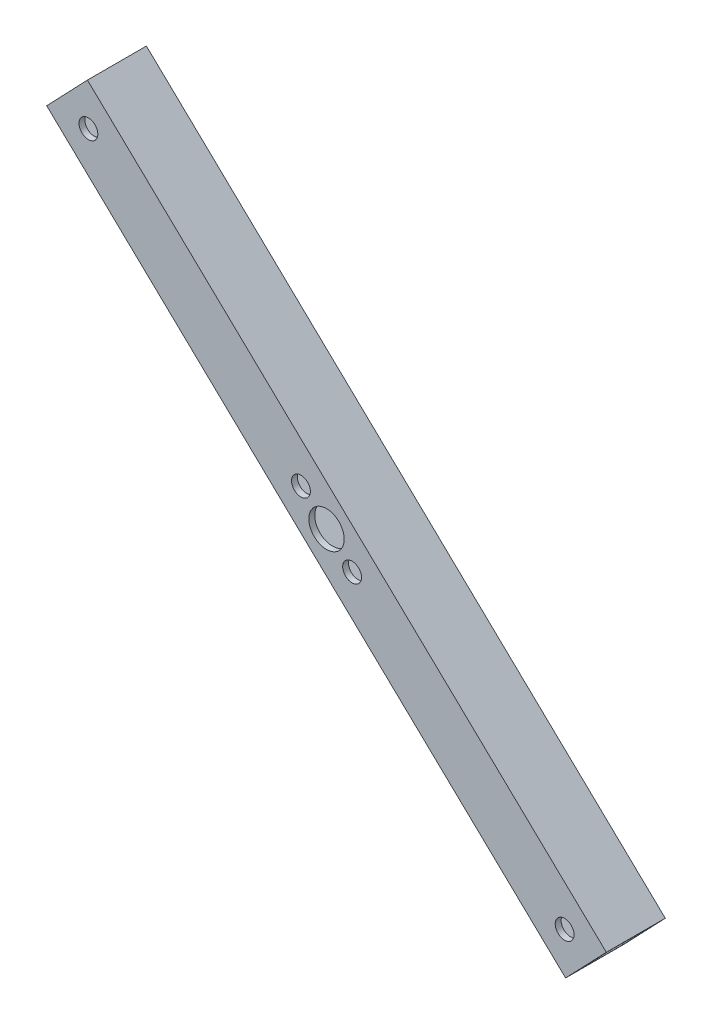
ISO-10303-21;
HEADER;
FILE_DESCRIPTION(('STEP AP214'),'2;1');
FILE_NAME('part.step','',(''),(''),'','','');
FILE_SCHEMA(('AUTOMOTIVE_DESIGN { 1 0 10303 214 1 1 1 1 }'));
ENDSEC;
DATA;
#1=APPLICATION_CONTEXT('core data for automotive mechanical design processes');
#2=APPLICATION_PROTOCOL_DEFINITION('international standard','automotive_design',2000,#1);
#3=PRODUCT_CONTEXT('',#1,'mechanical');
#4=PRODUCT('Part','Part','',(#3));
#5=PRODUCT_RELATED_PRODUCT_CATEGORY('part','',(#4));
#6=PRODUCT_DEFINITION_FORMATION('','',#4);
#7=PRODUCT_DEFINITION_CONTEXT('part definition',#1,'design');
#8=PRODUCT_DEFINITION('design','',#6,#7);
#9=PRODUCT_DEFINITION_SHAPE('','',#8);
#10=(LENGTH_UNIT() NAMED_UNIT(*) SI_UNIT(.MILLI.,.METRE.));
#11=(NAMED_UNIT(*) PLANE_ANGLE_UNIT() SI_UNIT($,.RADIAN.));
#12=(NAMED_UNIT(*) SI_UNIT($,.STERADIAN.) SOLID_ANGLE_UNIT());
#13=UNCERTAINTY_MEASURE_WITH_UNIT(LENGTH_MEASURE(1.E-05),#10,'distance_accuracy_value','');
#14=(GEOMETRIC_REPRESENTATION_CONTEXT(3) GLOBAL_UNCERTAINTY_ASSIGNED_CONTEXT((#13)) GLOBAL_UNIT_ASSIGNED_CONTEXT((#10,
#11,#12)) REPRESENTATION_CONTEXT('',''));
#15=CARTESIAN_POINT('',(0.,0.,0.));
#16=DIRECTION('',(0.,0.,1.));
#17=DIRECTION('',(1.,0.,0.));
#18=AXIS2_PLACEMENT_3D('',#15,#16,#17);
#19=CARTESIAN_POINT('',(-3.77609817293488,84.2848181798707,10.));
#20=DIRECTION('',(0.,0.,-1.));
#21=DIRECTION('',(-1.,0.,0.));
#22=AXIS2_PLACEMENT_3D('',#19,#20,#21);
#23=CYLINDRICAL_SURFACE('',#22,1.6);
#24=CARTESIAN_POINT('',(-3.77609817293488,84.2848181798707,9.));
#25=DIRECTION('',(0.,0.,1.));
#26=DIRECTION('',(1.,0.,0.));
#27=AXIS2_PLACEMENT_3D('',#24,#25,#26);
#28=CIRCLE('',#27,1.6);
#29=CARTESIAN_POINT('',(-2.17609817293488,84.2848181798707,9.));
#30=VERTEX_POINT('',#29);
#31=EDGE_CURVE('E145',#30,#30,#28,.T.);
#32=ORIENTED_EDGE('',*,*,#31,.F.);
#33=EDGE_LOOP('',(#32));
#34=FACE_BOUND('',#33,.T.);
#35=CARTESIAN_POINT('',(-3.77609817293488,84.2848181798707,10.));
#36=DIRECTION('',(0.,0.,1.));
#37=DIRECTION('',(1.,0.,0.));
#38=AXIS2_PLACEMENT_3D('',#35,#36,#37);
#39=CIRCLE('',#38,1.6);
#40=CARTESIAN_POINT('',(-2.17609817293488,84.2848181798707,10.));
#41=VERTEX_POINT('',#40);
#42=EDGE_CURVE('E155',#41,#41,#39,.T.);
#43=ORIENTED_EDGE('',*,*,#42,.T.);
#44=EDGE_LOOP('',(#43));
#45=FACE_BOUND('',#44,.T.);
#46=ADVANCED_FACE('F44',(#34,#45),#23,.F.);
#47=CARTESIAN_POINT('',(76.990408140841,7.09173909976924,10.));
#48=DIRECTION('',(0.,0.,-1.));
#49=DIRECTION('',(-1.,0.,0.));
#50=AXIS2_PLACEMENT_3D('',#47,#48,#49);
#51=CYLINDRICAL_SURFACE('',#50,1.60000000000001);
#52=CARTESIAN_POINT('',(76.990408140841,7.09173909976924,9.));
#53=DIRECTION('',(0.,0.,1.));
#54=DIRECTION('',(1.,0.,0.));
#55=AXIS2_PLACEMENT_3D('',#52,#53,#54);
#56=CIRCLE('',#55,1.60000000000001);
#57=CARTESIAN_POINT('',(78.590408140841,7.09173909976924,9.));
#58=VERTEX_POINT('',#57);
#59=EDGE_CURVE('E144',#58,#58,#56,.T.);
#60=ORIENTED_EDGE('',*,*,#59,.F.);
#61=EDGE_LOOP('',(#60));
#62=FACE_BOUND('',#61,.T.);
#63=CARTESIAN_POINT('',(76.990408140841,7.09173909976924,10.));
#64=DIRECTION('',(0.,0.,1.));
#65=DIRECTION('',(1.,0.,0.));
#66=AXIS2_PLACEMENT_3D('',#63,#64,#65);
#67=CIRCLE('',#66,1.60000000000001);
#68=CARTESIAN_POINT('',(78.590408140841,7.09173909976924,10.));
#69=VERTEX_POINT('',#68);
#70=EDGE_CURVE('E152',#69,#69,#67,.T.);
#71=ORIENTED_EDGE('',*,*,#70,.T.);
#72=EDGE_LOOP('',(#71));
#73=FACE_BOUND('',#72,.T.);
#74=ADVANCED_FACE('F246',(#62,#73),#51,.F.);
#75=CARTESIAN_POINT('',(40.3083714708663,-38.5249709137162,10.));
#76=DIRECTION('',(-0.722918282369836,0.690933540230496,0.));
#77=DIRECTION('',(-0.690933540230496,-0.722918282369836,0.));
#78=AXIS2_PLACEMENT_3D('',#75,#76,#77);
#79=PLANE('',#78);
#80=DIRECTION('',(0.,0.,-1.));
#81=VECTOR('',#80,1.);
#82=CARTESIAN_POINT('',(77.8412653917682,0.745398269137436,9.));
#83=LINE('',#82,#81);
#84=CARTESIAN_POINT('',(77.8412653917682,0.745398269137436,9.));
#85=VERTEX_POINT('',#84);
#86=CARTESIAN_POINT('',(77.8412653917682,0.745398269137436,1.));
#87=VERTEX_POINT('',#86);
#88=EDGE_CURVE('E123',#85,#87,#83,.T.);
#89=ORIENTED_EDGE('',*,*,#88,.F.);
#90=DIRECTION('',(-0.690933540230497,-0.722918282369835,0.));
#91=VECTOR('',#90,1.);
#92=CARTESIAN_POINT('',(77.8412653917682,0.745398269137436,9.));
#93=LINE('',#92,#91);
#94=CARTESIAN_POINT('',(83.3687337136122,6.52874452809612,9.));
#95=VERTEX_POINT('',#94);
#96=EDGE_CURVE('E61',#95,#85,#93,.T.);
#97=ORIENTED_EDGE('',*,*,#96,.F.);
#98=DIRECTION('',(0.,0.,1.));
#99=VECTOR('',#98,1.);
#100=CARTESIAN_POINT('',(83.3687337136122,6.52874452809612,9.));
#101=LINE('',#100,#99);
#102=CARTESIAN_POINT('',(83.3687337136122,6.52874452809612,1.));
#103=VERTEX_POINT('',#102);
#104=EDGE_CURVE('E130',#103,#95,#101,.T.);
#105=ORIENTED_EDGE('',*,*,#104,.F.);
#106=DIRECTION('',(0.690933540230497,0.722918282369835,0.));
#107=VECTOR('',#106,1.);
#108=CARTESIAN_POINT('',(77.8412653917682,0.745398269137436,1.));
#109=LINE('',#108,#107);
#110=EDGE_CURVE('E114',#87,#103,#109,.T.);
#111=ORIENTED_EDGE('',*,*,#110,.F.);
#112=EDGE_LOOP('',(#89,#97,#105,#111));
#113=FACE_BOUND('',#112,.T.);
#114=DIRECTION('',(0.690933540230496,0.722918282369836,0.));
#115=VECTOR('',#114,1.);
#116=CARTESIAN_POINT('',(40.3083714708663,-38.5249709137162,0.));
#117=LINE('',#116,#115);
#118=CARTESIAN_POINT('',(77.1503318515377,0.0224799867676109,0.));
#119=VERTEX_POINT('',#118);
#120=CARTESIAN_POINT('',(84.0596672538427,7.25166281046594,0.));
#121=VERTEX_POINT('',#120);
#122=EDGE_CURVE('E174',#119,#121,#117,.T.);
#123=ORIENTED_EDGE('',*,*,#122,.T.);
#124=DIRECTION('',(0.,0.,-1.));
#125=VECTOR('',#124,1.);
#126=CARTESIAN_POINT('',(84.0596672538427,7.25166281046594,10.));
#127=LINE('',#126,#125);
#128=CARTESIAN_POINT('',(84.0596672538427,7.25166281046594,10.));
#129=VERTEX_POINT('',#128);
#130=EDGE_CURVE('E190',#129,#121,#127,.T.);
#131=ORIENTED_EDGE('',*,*,#130,.F.);
#132=DIRECTION('',(0.690933540230496,0.722918282369836,0.));
#133=VECTOR('',#132,1.);
#134=CARTESIAN_POINT('',(40.3083714708663,-38.5249709137162,10.));
#135=LINE('',#134,#133);
#136=CARTESIAN_POINT('',(77.1503318515377,0.0224799867676109,10.));
#137=VERTEX_POINT('',#136);
#138=EDGE_CURVE('E159',#137,#129,#135,.T.);
#139=ORIENTED_EDGE('',*,*,#138,.F.);
#140=DIRECTION('',(0.,0.,-1.));
#141=VECTOR('',#140,1.);
#142=CARTESIAN_POINT('',(77.1503318515377,0.0224799867676109,10.));
#143=LINE('',#142,#141);
#144=EDGE_CURVE('E168',#137,#119,#143,.T.);
#145=ORIENTED_EDGE('',*,*,#144,.T.);
#146=EDGE_LOOP('',(#123,#131,#139,#145));
#147=FACE_BOUND('',#146,.T.);
#148=ADVANCED_FACE('F127',(#113,#147),#79,.F.);
#149=CARTESIAN_POINT('',(43.7512957829762,45.7766337241822,10.));
#150=DIRECTION('',(-0.690933540230495,-0.722918282369837,0.));
#151=DIRECTION('',(0.722918282369837,-0.690933540230495,0.));
#152=AXIS2_PLACEMENT_3D('',#149,#150,#151);
#153=PLANE('',#152);
#154=DIRECTION('',(-0.722918282369837,0.690933540230495,0.));
#155=VECTOR('',#154,1.);
#156=CARTESIAN_POINT('',(43.7512957829762,45.7766337241822,0.));
#157=LINE('',#156,#155);
#158=CARTESIAN_POINT('',(-3.93602188363157,91.3540772928723,0.));
#159=VERTEX_POINT('',#158);
#160=EDGE_CURVE('E177',#121,#159,#157,.T.);
#161=ORIENTED_EDGE('',*,*,#160,.T.);
#162=DIRECTION('',(0.,0.,-1.));
#163=VECTOR('',#162,1.);
#164=CARTESIAN_POINT('',(-3.93602188363157,91.3540772928723,10.));
#165=LINE('',#164,#163);
#166=CARTESIAN_POINT('',(-3.93602188363157,91.3540772928723,10.));
#167=VERTEX_POINT('',#166);
#168=EDGE_CURVE('E187',#167,#159,#165,.T.);
#169=ORIENTED_EDGE('',*,*,#168,.F.);
#170=DIRECTION('',(-0.722918282369837,0.690933540230495,0.));
#171=VECTOR('',#170,1.);
#172=CARTESIAN_POINT('',(43.7512957829762,45.7766337241822,10.));
#173=LINE('',#172,#171);
#174=EDGE_CURVE('E162',#129,#167,#173,.T.);
#175=ORIENTED_EDGE('',*,*,#174,.F.);
#176=ORIENTED_EDGE('',*,*,#130,.T.);
#177=EDGE_LOOP('',(#161,#169,#175,#176));
#178=FACE_BOUND('',#177,.T.);
#179=ADVANCED_FACE('F265',(#178),#153,.F.);
#180=CARTESIAN_POINT('',(-47.6873176666079,45.5774435686902,10.));
#181=DIRECTION('',(0.722918282369836,-0.690933540230496,0.));
#182=DIRECTION('',(0.690933540230496,0.722918282369836,0.));
#183=AXIS2_PLACEMENT_3D('',#180,#181,#182);
#184=PLANE('',#183);
#185=DIRECTION('',(0.,0.,1.));
#186=VECTOR('',#185,1.);
#187=CARTESIAN_POINT('',(-4.626955423862,90.6311590105026,10.));
#188=LINE('',#187,#186);
#189=CARTESIAN_POINT('',(-4.626955423862,90.6311590105026,1.));
#190=VERTEX_POINT('',#189);
#191=CARTESIAN_POINT('',(-4.626955423862,90.6311590105026,9.));
#192=VERTEX_POINT('',#191);
#193=EDGE_CURVE('E12',#190,#192,#188,.T.);
#194=ORIENTED_EDGE('',*,*,#193,.T.);
#195=DIRECTION('',(-0.690933540230496,-0.722918282369836,0.));
#196=VECTOR('',#195,1.);
#197=CARTESIAN_POINT('',(-47.6873176666079,45.5774435686902,9.));
#198=LINE('',#197,#196);
#199=CARTESIAN_POINT('',(-10.154423745706,84.8478127515439,9.));
#200=VERTEX_POINT('',#199);
#201=EDGE_CURVE('E148',#192,#200,#198,.T.);
#202=ORIENTED_EDGE('',*,*,#201,.T.);
#203=DIRECTION('',(0.,0.,-1.));
#204=VECTOR('',#203,1.);
#205=CARTESIAN_POINT('',(-10.154423745706,84.8478127515439,10.));
#206=LINE('',#205,#204);
#207=CARTESIAN_POINT('',(-10.154423745706,84.8478127515439,1.));
#208=VERTEX_POINT('',#207);
#209=EDGE_CURVE('E53',#200,#208,#206,.T.);
#210=ORIENTED_EDGE('',*,*,#209,.T.);
#211=DIRECTION('',(0.690933540230496,0.722918282369836,0.));
#212=VECTOR('',#211,1.);
#213=CARTESIAN_POINT('',(-47.6873176666079,45.5774435686902,1.));
#214=LINE('',#213,#212);
#215=EDGE_CURVE('E117',#208,#190,#214,.T.);
#216=ORIENTED_EDGE('',*,*,#215,.T.);
#217=EDGE_LOOP('',(#194,#202,#210,#216));
#218=FACE_BOUND('',#217,.T.);
#219=DIRECTION('',(-0.690933540230496,-0.722918282369836,0.));
#220=VECTOR('',#219,1.);
#221=CARTESIAN_POINT('',(-47.6873176666079,45.5774435686902,0.));
#222=LINE('',#221,#220);
#223=CARTESIAN_POINT('',(-10.8453572859366,84.124894469174,0.));
#224=VERTEX_POINT('',#223);
#225=EDGE_CURVE('E179',#159,#224,#222,.T.);
#226=ORIENTED_EDGE('',*,*,#225,.T.);
#227=DIRECTION('',(0.,0.,-1.));
#228=VECTOR('',#227,1.);
#229=CARTESIAN_POINT('',(-10.8453572859366,84.124894469174,10.));
#230=LINE('',#229,#228);
#231=CARTESIAN_POINT('',(-10.8453572859366,84.124894469174,10.));
#232=VERTEX_POINT('',#231);
#233=EDGE_CURVE('E184',#232,#224,#230,.T.);
#234=ORIENTED_EDGE('',*,*,#233,.F.);
#235=DIRECTION('',(-0.690933540230496,-0.722918282369836,0.));
#236=VECTOR('',#235,1.);
#237=CARTESIAN_POINT('',(-47.6873176666079,45.5774435686902,10.));
#238=LINE('',#237,#236);
#239=EDGE_CURVE('E164',#167,#232,#238,.T.);
#240=ORIENTED_EDGE('',*,*,#239,.F.);
#241=ORIENTED_EDGE('',*,*,#168,.T.);
#242=EDGE_LOOP('',(#226,#234,#240,#241));
#243=FACE_BOUND('',#242,.T.);
#244=ADVANCED_FACE('F257',(#218,#243),#184,.F.);
#245=CARTESIAN_POINT('',(-3.77609817293488,84.2848181798707,1.));
#246=DIRECTION('',(0.,0.,-1.));
#247=DIRECTION('',(-1.,0.,0.));
#248=AXIS2_PLACEMENT_3D('',#245,#246,#247);
#249=CIRCLE('',#248,1.6);
#250=CARTESIAN_POINT('',(-5.37609817293488,84.2848181798707,1.));
#251=VERTEX_POINT('',#250);
#252=EDGE_CURVE('E140',#251,#251,#249,.T.);
#253=ORIENTED_EDGE('',*,*,#252,.F.);
#254=EDGE_LOOP('',(#253));
#255=FACE_BOUND('',#254,.T.);
#256=CARTESIAN_POINT('',(-3.77609817293488,84.2848181798707,0.));
#257=DIRECTION('',(0.,0.,1.));
#258=DIRECTION('',(1.,0.,0.));
#259=AXIS2_PLACEMENT_3D('',#256,#257,#258);
#260=CIRCLE('',#259,1.6);
#261=CARTESIAN_POINT('',(-2.17609817293488,84.2848181798707,0.));
#262=VERTEX_POINT('',#261);
#263=EDGE_CURVE('E171',#262,#262,#260,.T.);
#264=ORIENTED_EDGE('',*,*,#263,.F.);
#265=EDGE_LOOP('',(#264));
#266=FACE_BOUND('',#265,.T.);
#267=ADVANCED_FACE('F248',(#255,#266),#23,.F.);
#268=CARTESIAN_POINT('',(76.990408140841,7.09173909976924,1.));
#269=DIRECTION('',(0.,0.,-1.));
#270=DIRECTION('',(-1.,0.,0.));
#271=AXIS2_PLACEMENT_3D('',#268,#269,#270);
#272=CIRCLE('',#271,1.60000000000001);
#273=CARTESIAN_POINT('',(75.390408140841,7.09173909976924,1.));
#274=VERTEX_POINT('',#273);
#275=EDGE_CURVE('E137',#274,#274,#272,.T.);
#276=ORIENTED_EDGE('',*,*,#275,.F.);
#277=EDGE_LOOP('',(#276));
#278=FACE_BOUND('',#277,.T.);
#279=CARTESIAN_POINT('',(76.990408140841,7.09173909976924,0.));
#280=DIRECTION('',(0.,0.,1.));
#281=DIRECTION('',(1.,0.,0.));
#282=AXIS2_PLACEMENT_3D('',#279,#280,#281);
#283=CIRCLE('',#282,1.60000000000001);
#284=CARTESIAN_POINT('',(78.590408140841,7.09173909976924,0.));
#285=VERTEX_POINT('',#284);
#286=EDGE_CURVE('E151',#285,#285,#283,.T.);
#287=ORIENTED_EDGE('',*,*,#286,.F.);
#288=EDGE_LOOP('',(#287));
#289=FACE_BOUND('',#288,.T.);
#290=ADVANCED_FACE('F46',(#278,#289),#51,.F.);
#291=CARTESIAN_POINT('',(36.8419603806713,38.5474509004838,10.));
#292=DIRECTION('',(0.690933540230495,0.722918282369836,0.));
#293=DIRECTION('',(-0.722918282369836,0.690933540230495,0.));
#294=AXIS2_PLACEMENT_3D('',#291,#292,#293);
#295=PLANE('',#294);
#296=DIRECTION('',(0.722918282369836,-0.690933540230495,0.));
#297=VECTOR('',#296,1.);
#298=CARTESIAN_POINT('',(36.8419603806713,38.5474509004838,0.));
#299=LINE('',#298,#297);
#300=EDGE_CURVE('E156',#224,#119,#299,.T.);
#301=ORIENTED_EDGE('',*,*,#300,.T.);
#302=ORIENTED_EDGE('',*,*,#144,.F.);
#303=DIRECTION('',(0.722918282369836,-0.690933540230495,0.));
#304=VECTOR('',#303,1.);
#305=CARTESIAN_POINT('',(36.8419603806713,38.5474509004838,10.));
#306=LINE('',#305,#304);
#307=EDGE_CURVE('E166',#232,#137,#306,.T.);
#308=ORIENTED_EDGE('',*,*,#307,.F.);
#309=ORIENTED_EDGE('',*,*,#233,.T.);
#310=EDGE_LOOP('',(#301,#302,#308,#309));
#311=FACE_BOUND('',#310,.T.);
#312=ADVANCED_FACE('F263',(#311),#295,.F.);
#313=CARTESIAN_POINT('',(0.,0.,10.));
#314=DIRECTION('',(0.,0.,1.));
#315=DIRECTION('',(1.,0.,0.));
#316=AXIS2_PLACEMENT_3D('',#313,#314,#315);
#317=PLANE('',#316);
#318=CARTESIAN_POINT('',(40.9446646781721,41.542677398437,10.));
#319=DIRECTION('',(0.,0.,1.));
#320=DIRECTION('',(1.,0.,0.));
#321=AXIS2_PLACEMENT_3D('',#318,#319,#320);
#322=CIRCLE('',#321,1.6);
#323=CARTESIAN_POINT('',(42.5446646781721,41.542677398437,10.));
#324=VERTEX_POINT('',#323);
#325=EDGE_CURVE('E435',#324,#324,#322,.T.);
#326=ORIENTED_EDGE('',*,*,#325,.F.);
#327=EDGE_LOOP('',(#326));
#328=FACE_BOUND('',#327,.T.);
#329=CARTESIAN_POINT('',(36.6071549839531,45.68827863982,10.));
#330=DIRECTION('',(0.,0.,1.));
#331=DIRECTION('',(1.,0.,0.));
#332=AXIS2_PLACEMENT_3D('',#329,#330,#331);
#333=CIRCLE('',#332,3.);
#334=CARTESIAN_POINT('',(39.6071549839531,45.68827863982,10.));
#335=VERTEX_POINT('',#334);
#336=EDGE_CURVE('E420',#335,#335,#333,.T.);
#337=ORIENTED_EDGE('',*,*,#336,.F.);
#338=EDGE_LOOP('',(#337));
#339=FACE_BOUND('',#338,.T.);
#340=CARTESIAN_POINT('',(32.269645289734,49.8338798812029,10.));
#341=DIRECTION('',(0.,0.,1.));
#342=DIRECTION('',(1.,0.,0.));
#343=AXIS2_PLACEMENT_3D('',#340,#341,#342);
#344=CIRCLE('',#343,1.60000000000001);
#345=CARTESIAN_POINT('',(33.869645289734,49.8338798812029,10.));
#346=VERTEX_POINT('',#345);
#347=EDGE_CURVE('E214',#346,#346,#344,.T.);
#348=ORIENTED_EDGE('',*,*,#347,.F.);
#349=EDGE_LOOP('',(#348));
#350=FACE_BOUND('',#349,.T.);
#351=ORIENTED_EDGE('',*,*,#70,.F.);
#352=EDGE_LOOP('',(#351));
#353=FACE_BOUND('',#352,.T.);
#354=ORIENTED_EDGE('',*,*,#42,.F.);
#355=EDGE_LOOP('',(#354));
#356=FACE_BOUND('',#355,.T.);
#357=ORIENTED_EDGE('',*,*,#138,.T.);
#358=ORIENTED_EDGE('',*,*,#174,.T.);
#359=ORIENTED_EDGE('',*,*,#239,.T.);
#360=ORIENTED_EDGE('',*,*,#307,.T.);
#361=EDGE_LOOP('',(#357,#358,#359,#360));
#362=FACE_BOUND('',#361,.T.);
#363=ADVANCED_FACE('F276',(#328,#339,#350,#353,#356,#362),#317,.T.);
#364=CARTESIAN_POINT('',(0.,0.,0.));
#365=DIRECTION('',(0.,0.,1.));
#366=DIRECTION('',(1.,0.,0.));
#367=AXIS2_PLACEMENT_3D('',#364,#365,#366);
#368=PLANE('',#367);
#369=CARTESIAN_POINT('',(40.9446646781721,41.542677398437,0.));
#370=DIRECTION('',(0.,0.,1.));
#371=DIRECTION('',(1.,0.,0.));
#372=AXIS2_PLACEMENT_3D('',#369,#370,#371);
#373=CIRCLE('',#372,1.6);
#374=CARTESIAN_POINT('',(42.5446646781721,41.542677398437,0.));
#375=VERTEX_POINT('',#374);
#376=EDGE_CURVE('E438',#375,#375,#373,.T.);
#377=ORIENTED_EDGE('',*,*,#376,.T.);
#378=EDGE_LOOP('',(#377));
#379=FACE_BOUND('',#378,.T.);
#380=CARTESIAN_POINT('',(36.6071549839531,45.68827863982,0.));
#381=DIRECTION('',(0.,0.,1.));
#382=DIRECTION('',(1.,0.,0.));
#383=AXIS2_PLACEMENT_3D('',#380,#381,#382);
#384=CIRCLE('',#383,3.);
#385=CARTESIAN_POINT('',(39.6071549839531,45.68827863982,0.));
#386=VERTEX_POINT('',#385);
#387=EDGE_CURVE('E432',#386,#386,#384,.T.);
#388=ORIENTED_EDGE('',*,*,#387,.T.);
#389=EDGE_LOOP('',(#388));
#390=FACE_BOUND('',#389,.T.);
#391=CARTESIAN_POINT('',(32.269645289734,49.8338798812029,0.));
#392=DIRECTION('',(0.,0.,1.));
#393=DIRECTION('',(1.,0.,0.));
#394=AXIS2_PLACEMENT_3D('',#391,#392,#393);
#395=CIRCLE('',#394,1.60000000000001);
#396=CARTESIAN_POINT('',(33.869645289734,49.8338798812029,0.));
#397=VERTEX_POINT('',#396);
#398=EDGE_CURVE('E201',#397,#397,#395,.T.);
#399=ORIENTED_EDGE('',*,*,#398,.T.);
#400=EDGE_LOOP('',(#399));
#401=FACE_BOUND('',#400,.T.);
#402=ORIENTED_EDGE('',*,*,#286,.T.);
#403=EDGE_LOOP('',(#402));
#404=FACE_BOUND('',#403,.T.);
#405=ORIENTED_EDGE('',*,*,#263,.T.);
#406=EDGE_LOOP('',(#405));
#407=FACE_BOUND('',#406,.T.);
#408=ORIENTED_EDGE('',*,*,#122,.F.);
#409=ORIENTED_EDGE('',*,*,#300,.F.);
#410=ORIENTED_EDGE('',*,*,#225,.F.);
#411=ORIENTED_EDGE('',*,*,#160,.F.);
#412=EDGE_LOOP('',(#408,#409,#410,#411));
#413=FACE_BOUND('',#412,.T.);
#414=ADVANCED_FACE('F272',(#379,#390,#401,#404,#407,#413),#368,.F.);
#415=CARTESIAN_POINT('',(-8.23784902292359,94.0822925046184,9.));
#416=DIRECTION('',(0.690933540230496,0.722918282369836,0.));
#417=DIRECTION('',(-0.722918282369836,0.690933540230496,0.));
#418=AXIS2_PLACEMENT_3D('',#415,#416,#417);
#419=PLANE('',#418);
#420=DIRECTION('',(0.722918282369836,-0.690933540230496,0.));
#421=VECTOR('',#420,1.);
#422=CARTESIAN_POINT('',(-8.23784902292359,94.0822925046184,1.));
#423=LINE('',#422,#421);
#424=EDGE_CURVE('E119',#190,#103,#423,.T.);
#425=ORIENTED_EDGE('',*,*,#424,.T.);
#426=ORIENTED_EDGE('',*,*,#104,.T.);
#427=DIRECTION('',(0.722918282369836,-0.690933540230496,0.));
#428=VECTOR('',#427,1.);
#429=CARTESIAN_POINT('',(-8.23784902292359,94.0822925046184,9.));
#430=LINE('',#429,#428);
#431=EDGE_CURVE('E135',#192,#95,#430,.T.);
#432=ORIENTED_EDGE('',*,*,#431,.F.);
#433=ORIENTED_EDGE('',*,*,#193,.F.);
#434=EDGE_LOOP('',(#425,#426,#432,#433));
#435=FACE_BOUND('',#434,.T.);
#436=ADVANCED_FACE('F275',(#435),#419,.F.);
#437=CARTESIAN_POINT('',(-13.7653173447676,88.2989462456598,9.));
#438=DIRECTION('',(-0.690933540230496,-0.722918282369836,0.));
#439=DIRECTION('',(0.722918282369836,-0.690933540230496,0.));
#440=AXIS2_PLACEMENT_3D('',#437,#438,#439);
#441=PLANE('',#440);
#442=DIRECTION('',(0.722918282369836,-0.690933540230496,0.));
#443=VECTOR('',#442,1.);
#444=CARTESIAN_POINT('',(-13.7653173447676,88.2989462456598,9.));
#445=LINE('',#444,#443);
#446=EDGE_CURVE('E120',#200,#85,#445,.T.);
#447=ORIENTED_EDGE('',*,*,#446,.T.);
#448=ORIENTED_EDGE('',*,*,#88,.T.);
#449=DIRECTION('',(0.722918282369836,-0.690933540230496,0.));
#450=VECTOR('',#449,1.);
#451=CARTESIAN_POINT('',(-13.7653173447676,88.2989462456598,1.));
#452=LINE('',#451,#450);
#453=EDGE_CURVE('E69',#208,#87,#452,.T.);
#454=ORIENTED_EDGE('',*,*,#453,.F.);
#455=ORIENTED_EDGE('',*,*,#209,.F.);
#456=EDGE_LOOP('',(#447,#448,#454,#455));
#457=FACE_BOUND('',#456,.T.);
#458=ADVANCED_FACE('F124',(#457),#441,.F.);
#459=CARTESIAN_POINT('',(-13.7653173447676,88.2989462456598,9.));
#460=DIRECTION('',(0.,0.,1.));
#461=DIRECTION('',(1.,0.,0.));
#462=AXIS2_PLACEMENT_3D('',#459,#460,#461);
#463=PLANE('',#462);
#464=CARTESIAN_POINT('',(40.9446646781721,41.542677398437,9.));
#465=DIRECTION('',(0.,0.,1.));
#466=DIRECTION('',(1.,0.,0.));
#467=AXIS2_PLACEMENT_3D('',#464,#465,#466);
#468=CIRCLE('',#467,1.6);
#469=CARTESIAN_POINT('',(42.5446646781721,41.542677398437,9.));
#470=VERTEX_POINT('',#469);
#471=EDGE_CURVE('E217',#470,#470,#468,.T.);
#472=ORIENTED_EDGE('',*,*,#471,.T.);
#473=EDGE_LOOP('',(#472));
#474=FACE_BOUND('',#473,.T.);
#475=CARTESIAN_POINT('',(36.6071549839531,45.68827863982,9.));
#476=DIRECTION('',(0.,0.,1.));
#477=DIRECTION('',(1.,0.,0.));
#478=AXIS2_PLACEMENT_3D('',#475,#476,#477);
#479=CIRCLE('',#478,3.);
#480=CARTESIAN_POINT('',(39.6071549839531,45.68827863982,9.));
#481=VERTEX_POINT('',#480);
#482=EDGE_CURVE('E204',#481,#481,#479,.T.);
#483=ORIENTED_EDGE('',*,*,#482,.T.);
#484=EDGE_LOOP('',(#483));
#485=FACE_BOUND('',#484,.T.);
#486=CARTESIAN_POINT('',(32.269645289734,49.8338798812029,9.));
#487=DIRECTION('',(0.,0.,1.));
#488=DIRECTION('',(1.,0.,0.));
#489=AXIS2_PLACEMENT_3D('',#486,#487,#488);
#490=CIRCLE('',#489,1.60000000000001);
#491=CARTESIAN_POINT('',(33.869645289734,49.8338798812029,9.));
#492=VERTEX_POINT('',#491);
#493=EDGE_CURVE('E200',#492,#492,#490,.T.);
#494=ORIENTED_EDGE('',*,*,#493,.T.);
#495=EDGE_LOOP('',(#494));
#496=FACE_BOUND('',#495,.T.);
#497=ORIENTED_EDGE('',*,*,#31,.T.);
#498=EDGE_LOOP('',(#497));
#499=FACE_BOUND('',#498,.T.);
#500=ORIENTED_EDGE('',*,*,#59,.T.);
#501=EDGE_LOOP('',(#500));
#502=FACE_BOUND('',#501,.T.);
#503=ORIENTED_EDGE('',*,*,#431,.T.);
#504=ORIENTED_EDGE('',*,*,#96,.T.);
#505=ORIENTED_EDGE('',*,*,#446,.F.);
#506=ORIENTED_EDGE('',*,*,#201,.F.);
#507=EDGE_LOOP('',(#503,#504,#505,#506));
#508=FACE_BOUND('',#507,.T.);
#509=ADVANCED_FACE('F303',(#474,#485,#496,#499,#502,#508),#463,.F.);
#510=CARTESIAN_POINT('',(-13.7653173447676,88.2989462456598,1.));
#511=DIRECTION('',(0.,0.,-1.));
#512=DIRECTION('',(-1.,0.,0.));
#513=AXIS2_PLACEMENT_3D('',#510,#511,#512);
#514=PLANE('',#513);
#515=CARTESIAN_POINT('',(40.9446646781721,41.542677398437,1.));
#516=DIRECTION('',(0.,0.,-1.));
#517=DIRECTION('',(-1.,0.,0.));
#518=AXIS2_PLACEMENT_3D('',#515,#516,#517);
#519=CIRCLE('',#518,1.6);
#520=CARTESIAN_POINT('',(39.3446646781721,41.542677398437,1.));
#521=VERTEX_POINT('',#520);
#522=EDGE_CURVE('E48',#521,#521,#519,.T.);
#523=ORIENTED_EDGE('',*,*,#522,.T.);
#524=EDGE_LOOP('',(#523));
#525=FACE_BOUND('',#524,.T.);
#526=CARTESIAN_POINT('',(36.6071549839531,45.68827863982,1.));
#527=DIRECTION('',(0.,0.,-1.));
#528=DIRECTION('',(-1.,0.,0.));
#529=AXIS2_PLACEMENT_3D('',#526,#527,#528);
#530=CIRCLE('',#529,3.);
#531=CARTESIAN_POINT('',(33.6071549839531,45.68827863982,1.));
#532=VERTEX_POINT('',#531);
#533=EDGE_CURVE('E202',#532,#532,#530,.T.);
#534=ORIENTED_EDGE('',*,*,#533,.T.);
#535=EDGE_LOOP('',(#534));
#536=FACE_BOUND('',#535,.T.);
#537=CARTESIAN_POINT('',(32.269645289734,49.8338798812029,1.));
#538=DIRECTION('',(0.,0.,-1.));
#539=DIRECTION('',(-1.,0.,0.));
#540=AXIS2_PLACEMENT_3D('',#537,#538,#539);
#541=CIRCLE('',#540,1.60000000000001);
#542=CARTESIAN_POINT('',(30.669645289734,49.8338798812029,1.));
#543=VERTEX_POINT('',#542);
#544=EDGE_CURVE('E198',#543,#543,#541,.T.);
#545=ORIENTED_EDGE('',*,*,#544,.T.);
#546=EDGE_LOOP('',(#545));
#547=FACE_BOUND('',#546,.T.);
#548=ORIENTED_EDGE('',*,*,#252,.T.);
#549=EDGE_LOOP('',(#548));
#550=FACE_BOUND('',#549,.T.);
#551=ORIENTED_EDGE('',*,*,#275,.T.);
#552=EDGE_LOOP('',(#551));
#553=FACE_BOUND('',#552,.T.);
#554=ORIENTED_EDGE('',*,*,#453,.T.);
#555=ORIENTED_EDGE('',*,*,#110,.T.);
#556=ORIENTED_EDGE('',*,*,#424,.F.);
#557=ORIENTED_EDGE('',*,*,#215,.F.);
#558=EDGE_LOOP('',(#554,#555,#556,#557));
#559=FACE_BOUND('',#558,.T.);
#560=ADVANCED_FACE('F111',(#525,#536,#547,#550,#553,#559),#514,.F.);
#561=CARTESIAN_POINT('',(32.269645289734,49.8338798812029,0.));
#562=DIRECTION('',(0.,0.,1.));
#563=DIRECTION('',(1.,0.,0.));
#564=AXIS2_PLACEMENT_3D('',#561,#562,#563);
#565=CYLINDRICAL_SURFACE('',#564,1.60000000000001);
#566=ORIENTED_EDGE('',*,*,#398,.F.);
#567=EDGE_LOOP('',(#566));
#568=FACE_BOUND('',#567,.T.);
#569=ORIENTED_EDGE('',*,*,#544,.F.);
#570=EDGE_LOOP('',(#569));
#571=FACE_BOUND('',#570,.T.);
#572=ADVANCED_FACE('F239',(#568,#571),#565,.F.);
#573=CARTESIAN_POINT('',(36.6071549839531,45.68827863982,0.));
#574=DIRECTION('',(0.,0.,1.));
#575=DIRECTION('',(1.,0.,0.));
#576=AXIS2_PLACEMENT_3D('',#573,#574,#575);
#577=CYLINDRICAL_SURFACE('',#576,3.);
#578=ORIENTED_EDGE('',*,*,#387,.F.);
#579=EDGE_LOOP('',(#578));
#580=FACE_BOUND('',#579,.T.);
#581=ORIENTED_EDGE('',*,*,#533,.F.);
#582=EDGE_LOOP('',(#581));
#583=FACE_BOUND('',#582,.T.);
#584=ADVANCED_FACE('F228',(#580,#583),#577,.F.);
#585=CARTESIAN_POINT('',(40.9446646781721,41.542677398437,0.));
#586=DIRECTION('',(0.,0.,1.));
#587=DIRECTION('',(1.,0.,0.));
#588=AXIS2_PLACEMENT_3D('',#585,#586,#587);
#589=CYLINDRICAL_SURFACE('',#588,1.6);
#590=ORIENTED_EDGE('',*,*,#376,.F.);
#591=EDGE_LOOP('',(#590));
#592=FACE_BOUND('',#591,.T.);
#593=ORIENTED_EDGE('',*,*,#522,.F.);
#594=EDGE_LOOP('',(#593));
#595=FACE_BOUND('',#594,.T.);
#596=ADVANCED_FACE('F225',(#592,#595),#589,.F.);
#597=ORIENTED_EDGE('',*,*,#347,.T.);
#598=EDGE_LOOP('',(#597));
#599=FACE_BOUND('',#598,.T.);
#600=ORIENTED_EDGE('',*,*,#493,.F.);
#601=EDGE_LOOP('',(#600));
#602=FACE_BOUND('',#601,.T.);
#603=ADVANCED_FACE('F227',(#599,#602),#565,.F.);
#604=ORIENTED_EDGE('',*,*,#336,.T.);
#605=EDGE_LOOP('',(#604));
#606=FACE_BOUND('',#605,.T.);
#607=ORIENTED_EDGE('',*,*,#482,.F.);
#608=EDGE_LOOP('',(#607));
#609=FACE_BOUND('',#608,.T.);
#610=ADVANCED_FACE('F236',(#606,#609),#577,.F.);
#611=ORIENTED_EDGE('',*,*,#325,.T.);
#612=EDGE_LOOP('',(#611));
#613=FACE_BOUND('',#612,.T.);
#614=ORIENTED_EDGE('',*,*,#471,.F.);
#615=EDGE_LOOP('',(#614));
#616=FACE_BOUND('',#615,.T.);
#617=ADVANCED_FACE('F231',(#613,#616),#589,.F.);
#618=CLOSED_SHELL('',(#46,#74,#148,#179,#244,#267,#290,#312,#363,#414,#436,#458,#509,#560,#572,
#584,#596,#603,#610,#617));
#619=MANIFOLD_SOLID_BREP('B2',#618);
#620=ADVANCED_BREP_SHAPE_REPRESENTATION('',(#18,#619),#14);
#621=SHAPE_DEFINITION_REPRESENTATION(#9,#620);
ENDSEC;
END-ISO-10303-21;
